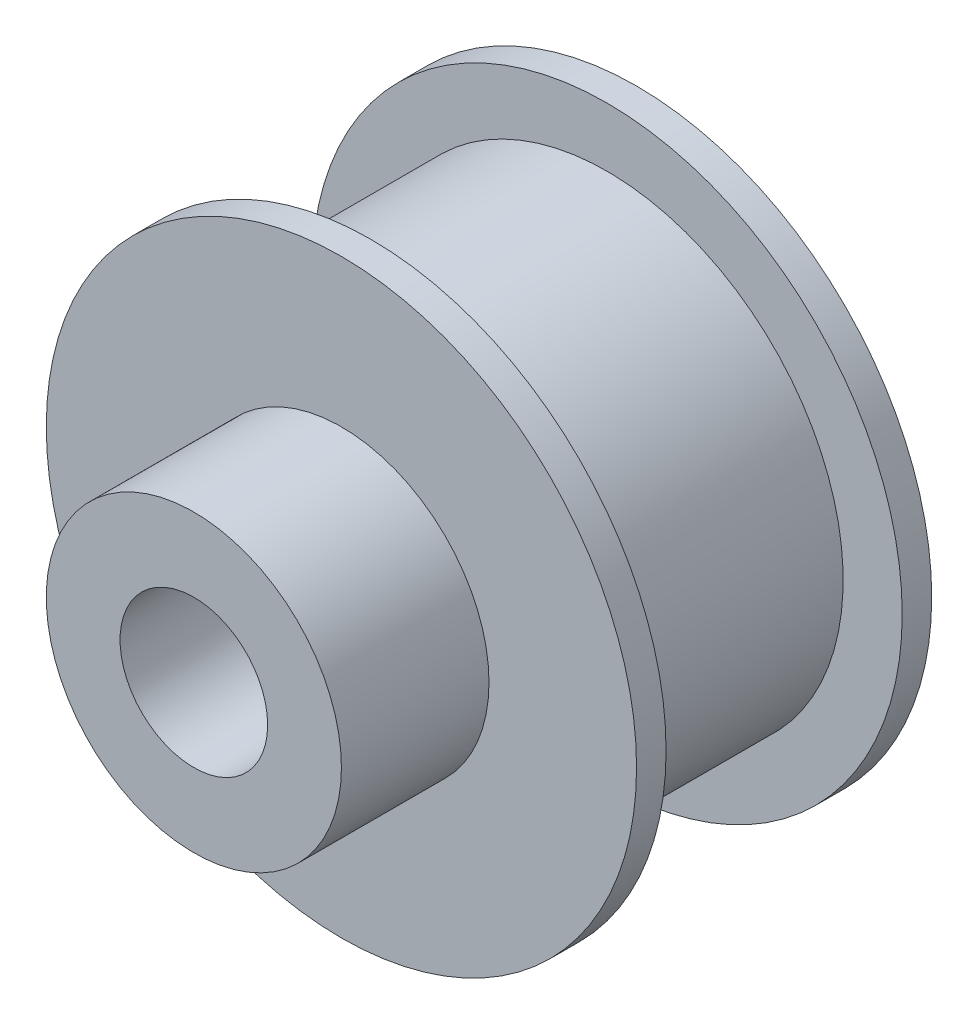
ISO-10303-21;
HEADER;
FILE_DESCRIPTION(('STEP AP214'),'2;1');
FILE_NAME('part.step','',(''),(''),'','','');
FILE_SCHEMA(('AUTOMOTIVE_DESIGN { 1 0 10303 214 1 1 1 1 }'));
ENDSEC;
DATA;
#1=APPLICATION_CONTEXT('core data for automotive mechanical design processes');
#2=APPLICATION_PROTOCOL_DEFINITION('international standard','automotive_design',2000,#1);
#3=PRODUCT_CONTEXT('',#1,'mechanical');
#4=PRODUCT('Part','Part','',(#3));
#5=PRODUCT_RELATED_PRODUCT_CATEGORY('part','',(#4));
#6=PRODUCT_DEFINITION_FORMATION('','',#4);
#7=PRODUCT_DEFINITION_CONTEXT('part definition',#1,'design');
#8=PRODUCT_DEFINITION('design','',#6,#7);
#9=PRODUCT_DEFINITION_SHAPE('','',#8);
#10=(LENGTH_UNIT() NAMED_UNIT(*) SI_UNIT(.MILLI.,.METRE.));
#11=(NAMED_UNIT(*) PLANE_ANGLE_UNIT() SI_UNIT($,.RADIAN.));
#12=(NAMED_UNIT(*) SI_UNIT($,.STERADIAN.) SOLID_ANGLE_UNIT());
#13=UNCERTAINTY_MEASURE_WITH_UNIT(LENGTH_MEASURE(1.E-05),#10,'distance_accuracy_value','');
#14=(GEOMETRIC_REPRESENTATION_CONTEXT(3) GLOBAL_UNCERTAINTY_ASSIGNED_CONTEXT((#13)) GLOBAL_UNIT_ASSIGNED_CONTEXT((#10,
#11,#12)) REPRESENTATION_CONTEXT('',''));
#15=CARTESIAN_POINT('',(0.,0.,0.));
#16=DIRECTION('',(0.,0.,1.));
#17=DIRECTION('',(1.,0.,0.));
#18=AXIS2_PLACEMENT_3D('',#15,#16,#17);
#19=CARTESIAN_POINT('',(0.,0.,10.));
#20=DIRECTION('',(0.,0.,-1.));
#21=DIRECTION('',(-1.,0.,0.));
#22=AXIS2_PLACEMENT_3D('',#19,#20,#21);
#23=CYLINDRICAL_SURFACE('',#22,10.);
#24=CARTESIAN_POINT('',(0.,0.,1.));
#25=DIRECTION('',(0.,0.,-1.));
#26=DIRECTION('',(-1.,0.,0.));
#27=AXIS2_PLACEMENT_3D('',#24,#25,#26);
#28=CIRCLE('',#27,10.);
#29=CARTESIAN_POINT('',(-10.,0.,1.));
#30=VERTEX_POINT('',#29);
#31=EDGE_CURVE('E66',#30,#30,#28,.T.);
#32=ORIENTED_EDGE('',*,*,#31,.T.);
#33=EDGE_LOOP('',(#32));
#34=FACE_BOUND('',#33,.T.);
#35=CARTESIAN_POINT('',(0.,0.,0.));
#36=DIRECTION('',(0.,0.,1.));
#37=DIRECTION('',(1.,0.,0.));
#38=AXIS2_PLACEMENT_3D('',#35,#36,#37);
#39=CIRCLE('',#38,10.);
#40=CARTESIAN_POINT('',(10.,0.,0.));
#41=VERTEX_POINT('',#40);
#42=EDGE_CURVE('E38',#41,#41,#39,.T.);
#43=ORIENTED_EDGE('',*,*,#42,.T.);
#44=EDGE_LOOP('',(#43));
#45=FACE_BOUND('',#44,.T.);
#46=ADVANCED_FACE('F34',(#34,#45),#23,.T.);
#47=CARTESIAN_POINT('',(0.,0.,9.));
#48=DIRECTION('',(0.,0.,-1.));
#49=DIRECTION('',(-1.,0.,0.));
#50=AXIS2_PLACEMENT_3D('',#47,#48,#49);
#51=CIRCLE('',#50,10.);
#52=CARTESIAN_POINT('',(-10.,0.,9.));
#53=VERTEX_POINT('',#52);
#54=EDGE_CURVE('E63',#53,#53,#51,.T.);
#55=ORIENTED_EDGE('',*,*,#54,.F.);
#56=EDGE_LOOP('',(#55));
#57=FACE_BOUND('',#56,.T.);
#58=CARTESIAN_POINT('',(0.,0.,10.));
#59=DIRECTION('',(0.,0.,1.));
#60=DIRECTION('',(1.,0.,0.));
#61=AXIS2_PLACEMENT_3D('',#58,#59,#60);
#62=CIRCLE('',#61,10.);
#63=CARTESIAN_POINT('',(10.,0.,10.));
#64=VERTEX_POINT('',#63);
#65=EDGE_CURVE('E42',#64,#64,#62,.T.);
#66=ORIENTED_EDGE('',*,*,#65,.F.);
#67=EDGE_LOOP('',(#66));
#68=FACE_BOUND('',#67,.T.);
#69=ADVANCED_FACE('F36',(#57,#68),#23,.T.);
#70=CARTESIAN_POINT('',(0.,0.,10.));
#71=DIRECTION('',(0.,0.,1.));
#72=DIRECTION('',(1.,0.,0.));
#73=AXIS2_PLACEMENT_3D('',#70,#71,#72);
#74=PLANE('',#73);
#75=CARTESIAN_POINT('',(0.,0.,10.));
#76=DIRECTION('',(0.,0.,1.));
#77=DIRECTION('',(1.,0.,0.));
#78=AXIS2_PLACEMENT_3D('',#75,#76,#77);
#79=CIRCLE('',#78,5.);
#80=CARTESIAN_POINT('',(5.,0.,10.));
#81=VERTEX_POINT('',#80);
#82=EDGE_CURVE('E10',#81,#81,#79,.T.);
#83=ORIENTED_EDGE('',*,*,#82,.F.);
#84=EDGE_LOOP('',(#83));
#85=FACE_BOUND('',#84,.T.);
#86=ORIENTED_EDGE('',*,*,#65,.T.);
#87=EDGE_LOOP('',(#86));
#88=FACE_BOUND('',#87,.T.);
#89=ADVANCED_FACE('F93',(#85,#88),#74,.T.);
#90=CARTESIAN_POINT('',(0.,0.,0.));
#91=DIRECTION('',(0.,0.,1.));
#92=DIRECTION('',(1.,0.,0.));
#93=AXIS2_PLACEMENT_3D('',#90,#91,#92);
#94=PLANE('',#93);
#95=CARTESIAN_POINT('',(0.,0.,0.));
#96=DIRECTION('',(0.,0.,1.));
#97=DIRECTION('',(1.,0.,0.));
#98=AXIS2_PLACEMENT_3D('',#95,#96,#97);
#99=CIRCLE('',#98,2.5);
#100=CARTESIAN_POINT('',(2.5,0.,0.));
#101=VERTEX_POINT('',#100);
#102=EDGE_CURVE('E51',#101,#101,#99,.T.);
#103=ORIENTED_EDGE('',*,*,#102,.T.);
#104=EDGE_LOOP('',(#103));
#105=FACE_BOUND('',#104,.T.);
#106=ORIENTED_EDGE('',*,*,#42,.F.);
#107=EDGE_LOOP('',(#106));
#108=FACE_BOUND('',#107,.T.);
#109=ADVANCED_FACE('F97',(#105,#108),#94,.F.);
#110=CARTESIAN_POINT('',(0.,0.,15.));
#111=DIRECTION('',(0.,0.,-1.));
#112=DIRECTION('',(-1.,0.,0.));
#113=AXIS2_PLACEMENT_3D('',#110,#111,#112);
#114=CYLINDRICAL_SURFACE('',#113,5.);
#115=CARTESIAN_POINT('',(0.,0.,15.));
#116=DIRECTION('',(0.,0.,1.));
#117=DIRECTION('',(1.,0.,0.));
#118=AXIS2_PLACEMENT_3D('',#115,#116,#117);
#119=CIRCLE('',#118,5.);
#120=CARTESIAN_POINT('',(5.,0.,15.));
#121=VERTEX_POINT('',#120);
#122=EDGE_CURVE('E48',#121,#121,#119,.T.);
#123=ORIENTED_EDGE('',*,*,#122,.F.);
#124=EDGE_LOOP('',(#123));
#125=FACE_BOUND('',#124,.T.);
#126=ORIENTED_EDGE('',*,*,#82,.T.);
#127=EDGE_LOOP('',(#126));
#128=FACE_BOUND('',#127,.T.);
#129=ADVANCED_FACE('F103',(#125,#128),#114,.T.);
#130=CARTESIAN_POINT('',(0.,0.,15.));
#131=DIRECTION('',(0.,0.,1.));
#132=DIRECTION('',(1.,0.,0.));
#133=AXIS2_PLACEMENT_3D('',#130,#131,#132);
#134=PLANE('',#133);
#135=CARTESIAN_POINT('',(0.,0.,15.));
#136=DIRECTION('',(0.,0.,1.));
#137=DIRECTION('',(1.,0.,0.));
#138=AXIS2_PLACEMENT_3D('',#135,#136,#137);
#139=CIRCLE('',#138,2.5);
#140=CARTESIAN_POINT('',(2.5,0.,15.));
#141=VERTEX_POINT('',#140);
#142=EDGE_CURVE('E52',#141,#141,#139,.T.);
#143=ORIENTED_EDGE('',*,*,#142,.F.);
#144=EDGE_LOOP('',(#143));
#145=FACE_BOUND('',#144,.T.);
#146=ORIENTED_EDGE('',*,*,#122,.T.);
#147=EDGE_LOOP('',(#146));
#148=FACE_BOUND('',#147,.T.);
#149=ADVANCED_FACE('F140',(#145,#148),#134,.T.);
#150=CARTESIAN_POINT('',(0.,0.,0.));
#151=DIRECTION('',(0.,0.,1.));
#152=DIRECTION('',(1.,0.,0.));
#153=AXIS2_PLACEMENT_3D('',#150,#151,#152);
#154=CYLINDRICAL_SURFACE('',#153,2.5);
#155=ORIENTED_EDGE('',*,*,#102,.F.);
#156=EDGE_LOOP('',(#155));
#157=FACE_BOUND('',#156,.T.);
#158=ORIENTED_EDGE('',*,*,#142,.T.);
#159=EDGE_LOOP('',(#158));
#160=FACE_BOUND('',#159,.T.);
#161=ADVANCED_FACE('F76',(#157,#160),#154,.F.);
#162=CARTESIAN_POINT('',(0.,10.,1.));
#163=DIRECTION('',(0.,0.,-1.));
#164=DIRECTION('',(-1.,0.,0.));
#165=AXIS2_PLACEMENT_3D('',#162,#163,#164);
#166=PLANE('',#165);
#167=ORIENTED_EDGE('',*,*,#31,.F.);
#168=EDGE_LOOP('',(#167));
#169=FACE_BOUND('',#168,.T.);
#170=CARTESIAN_POINT('',(0.,0.,1.));
#171=DIRECTION('',(0.,0.,-1.));
#172=DIRECTION('',(-1.,0.,0.));
#173=AXIS2_PLACEMENT_3D('',#170,#171,#172);
#174=CIRCLE('',#173,8.);
#175=CARTESIAN_POINT('',(-8.,0.,1.));
#176=VERTEX_POINT('',#175);
#177=EDGE_CURVE('E55',#176,#176,#174,.T.);
#178=ORIENTED_EDGE('',*,*,#177,.T.);
#179=EDGE_LOOP('',(#178));
#180=FACE_BOUND('',#179,.T.);
#181=ADVANCED_FACE('F72',(#169,#180),#166,.F.);
#182=CARTESIAN_POINT('',(0.,0.,0.));
#183=DIRECTION('',(0.,0.,-1.));
#184=DIRECTION('',(-1.,0.,0.));
#185=AXIS2_PLACEMENT_3D('',#182,#183,#184);
#186=CYLINDRICAL_SURFACE('',#185,8.);
#187=ORIENTED_EDGE('',*,*,#177,.F.);
#188=EDGE_LOOP('',(#187));
#189=FACE_BOUND('',#188,.T.);
#190=CARTESIAN_POINT('',(0.,0.,9.));
#191=DIRECTION('',(0.,0.,-1.));
#192=DIRECTION('',(-1.,0.,0.));
#193=AXIS2_PLACEMENT_3D('',#190,#191,#192);
#194=CIRCLE('',#193,8.);
#195=CARTESIAN_POINT('',(-8.,0.,9.));
#196=VERTEX_POINT('',#195);
#197=EDGE_CURVE('E60',#196,#196,#194,.T.);
#198=ORIENTED_EDGE('',*,*,#197,.T.);
#199=EDGE_LOOP('',(#198));
#200=FACE_BOUND('',#199,.T.);
#201=ADVANCED_FACE('F75',(#189,#200),#186,.T.);
#202=CARTESIAN_POINT('',(0.,10.,9.));
#203=DIRECTION('',(0.,0.,1.));
#204=DIRECTION('',(1.,0.,0.));
#205=AXIS2_PLACEMENT_3D('',#202,#203,#204);
#206=PLANE('',#205);
#207=ORIENTED_EDGE('',*,*,#197,.F.);
#208=EDGE_LOOP('',(#207));
#209=FACE_BOUND('',#208,.T.);
#210=ORIENTED_EDGE('',*,*,#54,.T.);
#211=EDGE_LOOP('',(#210));
#212=FACE_BOUND('',#211,.T.);
#213=ADVANCED_FACE('F82',(#209,#212),#206,.F.);
#214=CLOSED_SHELL('',(#46,#69,#89,#109,#129,#149,#161,#181,#201,#213));
#215=MANIFOLD_SOLID_BREP('B2',#214);
#216=ADVANCED_BREP_SHAPE_REPRESENTATION('',(#18,#215),#14);
#217=SHAPE_DEFINITION_REPRESENTATION(#9,#216);
ENDSEC;
END-ISO-10303-21;
